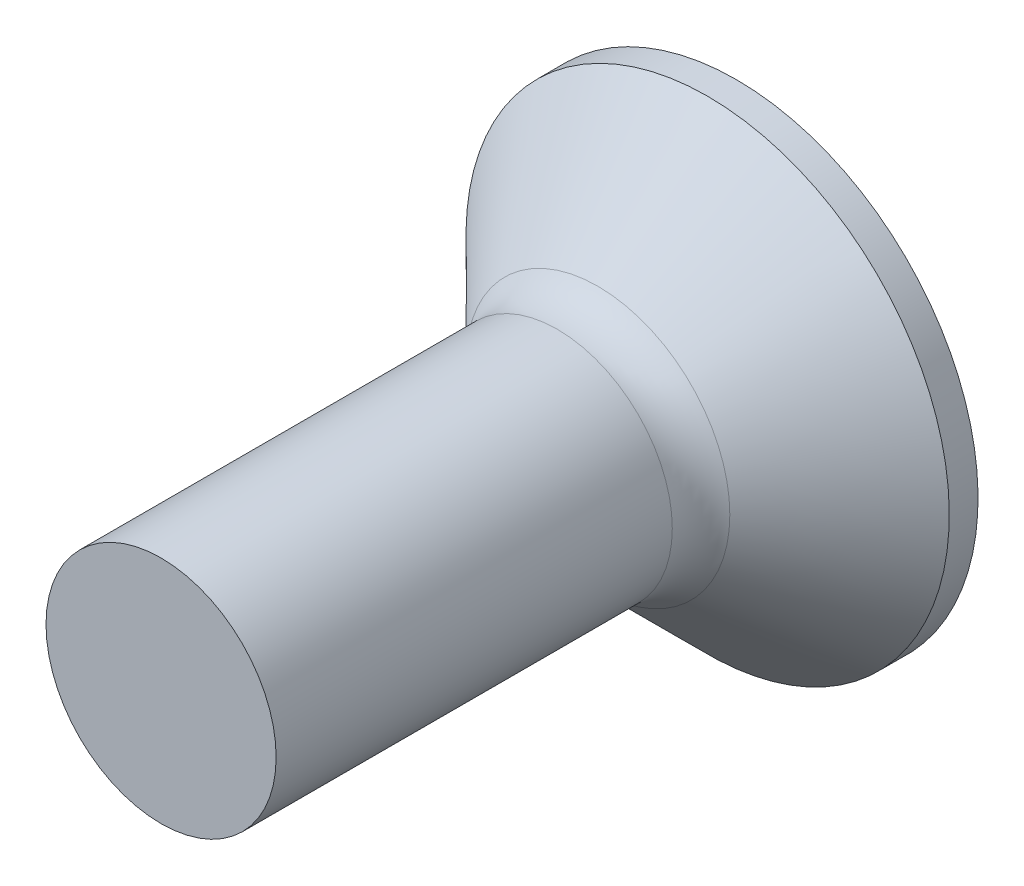
ISO-10303-21;
HEADER;
FILE_DESCRIPTION(('STEP AP214'),'2;1');
FILE_NAME('part.step','',(''),(''),'','','');
FILE_SCHEMA(('AUTOMOTIVE_DESIGN { 1 0 10303 214 1 1 1 1 }'));
ENDSEC;
DATA;
#1=APPLICATION_CONTEXT('core data for automotive mechanical design processes');
#2=APPLICATION_PROTOCOL_DEFINITION('international standard','automotive_design',2000,#1);
#3=PRODUCT_CONTEXT('',#1,'mechanical');
#4=PRODUCT('Part','Part','',(#3));
#5=PRODUCT_RELATED_PRODUCT_CATEGORY('part','',(#4));
#6=PRODUCT_DEFINITION_FORMATION('','',#4);
#7=PRODUCT_DEFINITION_CONTEXT('part definition',#1,'design');
#8=PRODUCT_DEFINITION('design','',#6,#7);
#9=PRODUCT_DEFINITION_SHAPE('','',#8);
#10=(LENGTH_UNIT() NAMED_UNIT(*) SI_UNIT(.MILLI.,.METRE.));
#11=(NAMED_UNIT(*) PLANE_ANGLE_UNIT() SI_UNIT($,.RADIAN.));
#12=(NAMED_UNIT(*) SI_UNIT($,.STERADIAN.) SOLID_ANGLE_UNIT());
#13=UNCERTAINTY_MEASURE_WITH_UNIT(LENGTH_MEASURE(1.E-05),#10,'distance_accuracy_value','');
#14=(GEOMETRIC_REPRESENTATION_CONTEXT(3) GLOBAL_UNCERTAINTY_ASSIGNED_CONTEXT((#13)) GLOBAL_UNIT_ASSIGNED_CONTEXT((#10,
#11,#12)) REPRESENTATION_CONTEXT('',''));
#15=CARTESIAN_POINT('',(0.,0.,0.));
#16=DIRECTION('',(0.,0.,1.));
#17=DIRECTION('',(1.,0.,0.));
#18=AXIS2_PLACEMENT_3D('',#15,#16,#17);
#19=CARTESIAN_POINT('',(0.,0.,-2.7));
#20=DIRECTION('',(0.,0.,-1.));
#21=DIRECTION('',(0.,1.,0.));
#22=AXIS2_PLACEMENT_3D('',#19,#20,#21);
#23=CONICAL_SURFACE('',#22,4.69999999999997,0.785398163397443);
#24=CARTESIAN_POINT('',(0.,0.,-0.292893218813454));
#25=DIRECTION('',(0.,0.,-1.));
#26=DIRECTION('',(0.,1.,0.));
#27=AXIS2_PLACEMENT_3D('',#24,#25,#26);
#28=CIRCLE('',#27,2.29289321881345);
#29=CARTESIAN_POINT('',(0.,2.29289321881345,-0.292893218813453));
#30=VERTEX_POINT('',#29);
#31=EDGE_CURVE('E42',#30,#30,#28,.T.);
#32=ORIENTED_EDGE('',*,*,#31,.T.);
#33=EDGE_LOOP('',(#32));
#34=FACE_BOUND('',#33,.T.);
#35=CARTESIAN_POINT('',(0.,0.,-2.20000000000003));
#36=DIRECTION('',(0.,0.,-1.));
#37=DIRECTION('',(0.,1.,0.));
#38=AXIS2_PLACEMENT_3D('',#35,#36,#37);
#39=CIRCLE('',#38,4.2);
#40=CARTESIAN_POINT('',(0.,4.2,-2.20000000000002));
#41=VERTEX_POINT('',#40);
#42=EDGE_CURVE('E266',#41,#41,#39,.F.);
#43=ORIENTED_EDGE('',*,*,#42,.T.);
#44=EDGE_LOOP('',(#43));
#45=FACE_BOUND('',#44,.T.);
#46=ADVANCED_FACE('F34',(#34,#45),#23,.T.);
#47=CARTESIAN_POINT('',(0.,0.,7.3));
#48=DIRECTION('',(0.,0.,1.));
#49=DIRECTION('',(0.,-1.,0.));
#50=AXIS2_PLACEMENT_3D('',#47,#48,#49);
#51=PLANE('',#50);
#52=CARTESIAN_POINT('',(0.,0.,7.3));
#53=DIRECTION('',(0.,0.,-1.));
#54=DIRECTION('',(0.,1.,0.));
#55=AXIS2_PLACEMENT_3D('',#52,#53,#54);
#56=CIRCLE('',#55,2.);
#57=CARTESIAN_POINT('',(0.,2.,7.3));
#58=VERTEX_POINT('',#57);
#59=EDGE_CURVE('E269',#58,#58,#56,.T.);
#60=ORIENTED_EDGE('',*,*,#59,.F.);
#61=EDGE_LOOP('',(#60));
#62=FACE_BOUND('',#61,.T.);
#63=ADVANCED_FACE('F36',(#62),#51,.T.);
#64=CARTESIAN_POINT('',(0.,0.,-2.7));
#65=DIRECTION('',(0.,0.,-1.));
#66=DIRECTION('',(0.,1.,0.));
#67=AXIS2_PLACEMENT_3D('',#64,#65,#66);
#68=CYLINDRICAL_SURFACE('',#67,2.);
#69=CARTESIAN_POINT('',(0.,0.,0.414213562373091));
#70=DIRECTION('',(0.,0.,-1.));
#71=DIRECTION('',(0.,1.,0.));
#72=AXIS2_PLACEMENT_3D('',#69,#70,#71);
#73=CIRCLE('',#72,2.);
#74=CARTESIAN_POINT('',(0.,2.,0.414213562373091));
#75=VERTEX_POINT('',#74);
#76=EDGE_CURVE('E11',#75,#75,#73,.F.);
#77=ORIENTED_EDGE('',*,*,#76,.T.);
#78=EDGE_LOOP('',(#77));
#79=FACE_BOUND('',#78,.T.);
#80=ORIENTED_EDGE('',*,*,#59,.T.);
#81=EDGE_LOOP('',(#80));
#82=FACE_BOUND('',#81,.T.);
#83=ADVANCED_FACE('F298',(#79,#82),#68,.T.);
#84=CARTESIAN_POINT('',(0.,0.,7.3));
#85=DIRECTION('',(0.,0.,-1.));
#86=DIRECTION('',(0.,1.,0.));
#87=AXIS2_PLACEMENT_3D('',#84,#85,#86);
#88=CYLINDRICAL_SURFACE('',#87,4.2);
#89=ORIENTED_EDGE('',*,*,#42,.F.);
#90=EDGE_LOOP('',(#89));
#91=FACE_BOUND('',#90,.T.);
#92=CARTESIAN_POINT('',(0.,0.,-2.7));
#93=DIRECTION('',(0.,0.,-1.));
#94=DIRECTION('',(0.,1.,0.));
#95=AXIS2_PLACEMENT_3D('',#92,#93,#94);
#96=CIRCLE('',#95,4.2);
#97=CARTESIAN_POINT('',(0.,4.2,-2.7));
#98=VERTEX_POINT('',#97);
#99=EDGE_CURVE('E262',#98,#98,#96,.T.);
#100=ORIENTED_EDGE('',*,*,#99,.F.);
#101=EDGE_LOOP('',(#100));
#102=FACE_BOUND('',#101,.T.);
#103=ADVANCED_FACE('F288',(#91,#102),#88,.T.);
#104=CARTESIAN_POINT('',(0.,4.69999999999997,-2.7));
#105=DIRECTION('',(0.,0.,-1.));
#106=DIRECTION('',(0.,1.,0.));
#107=AXIS2_PLACEMENT_3D('',#104,#105,#106);
#108=PLANE('',#107);
#109=CARTESIAN_POINT('',(1.13749999999999,-1.9702077936096,-2.7));
#110=DIRECTION('',(0.,0.,1.));
#111=DIRECTION('',(0.,1.,0.));
#112=AXIS2_PLACEMENT_3D('',#109,#110,#111);
#113=CIRCLE('',#112,0.85);
#114=CARTESIAN_POINT('',(1.51678967355004,-1.20952432229036,-2.7));
#115=VERTEX_POINT('',#114);
#116=CARTESIAN_POINT('',(0.289083952823566,-1.91834055063742,-2.7));
#117=VERTEX_POINT('',#116);
#118=EDGE_CURVE('E183',#115,#117,#113,.T.);
#119=ORIENTED_EDGE('',*,*,#118,.F.);
#120=CARTESIAN_POINT('',(0.,0.,-2.7));
#121=DIRECTION('',(0.,0.,-1.));
#122=DIRECTION('',(0.,1.,0.));
#123=AXIS2_PLACEMENT_3D('',#120,#121,#122);
#124=CIRCLE('',#123,1.94);
#125=CARTESIAN_POINT('',(1.80587362637363,-0.708816228347071,-2.7));
#126=VERTEX_POINT('',#125);
#127=EDGE_CURVE('E180',#126,#115,#124,.T.);
#128=ORIENTED_EDGE('',*,*,#127,.F.);
#129=CARTESIAN_POINT('',(2.275,0.,-2.7));
#130=DIRECTION('',(0.,0.,1.));
#131=DIRECTION('',(0.,1.,0.));
#132=AXIS2_PLACEMENT_3D('',#129,#130,#131);
#133=CIRCLE('',#132,0.85);
#134=CARTESIAN_POINT('',(1.80587362637363,0.708816228347071,-2.7));
#135=VERTEX_POINT('',#134);
#136=EDGE_CURVE('E178',#135,#126,#133,.T.);
#137=ORIENTED_EDGE('',*,*,#136,.F.);
#138=CARTESIAN_POINT('',(0.,0.,-2.7));
#139=DIRECTION('',(0.,0.,-1.));
#140=DIRECTION('',(0.,1.,0.));
#141=AXIS2_PLACEMENT_3D('',#138,#139,#140);
#142=CIRCLE('',#141,1.94);
#143=CARTESIAN_POINT('',(1.51678967355005,1.20952432229035,-2.7));
#144=VERTEX_POINT('',#143);
#145=EDGE_CURVE('E175',#144,#135,#142,.T.);
#146=ORIENTED_EDGE('',*,*,#145,.F.);
#147=CARTESIAN_POINT('',(1.1375,1.9702077936096,-2.7));
#148=DIRECTION('',(0.,0.,1.));
#149=DIRECTION('',(0.,1.,0.));
#150=AXIS2_PLACEMENT_3D('',#147,#148,#149);
#151=CIRCLE('',#150,0.85);
#152=CARTESIAN_POINT('',(0.289083952823581,1.91834055063742,-2.7));
#153=VERTEX_POINT('',#152);
#154=EDGE_CURVE('E170',#153,#144,#151,.T.);
#155=ORIENTED_EDGE('',*,*,#154,.F.);
#156=CARTESIAN_POINT('',(0.,0.,-2.7));
#157=DIRECTION('',(0.,0.,-1.));
#158=DIRECTION('',(0.,1.,0.));
#159=AXIS2_PLACEMENT_3D('',#156,#157,#158);
#160=CIRCLE('',#159,1.94);
#161=CARTESIAN_POINT('',(-0.289083952823582,1.91834055063742,-2.7));
#162=VERTEX_POINT('',#161);
#163=EDGE_CURVE('E168',#162,#153,#160,.T.);
#164=ORIENTED_EDGE('',*,*,#163,.F.);
#165=CARTESIAN_POINT('',(-1.1375,1.9702077936096,-2.7));
#166=DIRECTION('',(0.,0.,1.));
#167=DIRECTION('',(0.,1.,0.));
#168=AXIS2_PLACEMENT_3D('',#165,#166,#167);
#169=CIRCLE('',#168,0.85);
#170=CARTESIAN_POINT('',(-1.51678967355005,1.20952432229035,-2.7));
#171=VERTEX_POINT('',#170);
#172=EDGE_CURVE('E150',#171,#162,#169,.T.);
#173=ORIENTED_EDGE('',*,*,#172,.F.);
#174=CARTESIAN_POINT('',(0.,0.,-2.7));
#175=DIRECTION('',(0.,0.,-1.));
#176=DIRECTION('',(0.,1.,0.));
#177=AXIS2_PLACEMENT_3D('',#174,#175,#176);
#178=CIRCLE('',#177,1.94);
#179=CARTESIAN_POINT('',(-1.80587362637363,0.708816228347072,-2.7));
#180=VERTEX_POINT('',#179);
#181=EDGE_CURVE('E159',#180,#171,#178,.T.);
#182=ORIENTED_EDGE('',*,*,#181,.F.);
#183=CARTESIAN_POINT('',(-2.275,0.,-2.7));
#184=DIRECTION('',(0.,0.,1.));
#185=DIRECTION('',(0.,1.,0.));
#186=AXIS2_PLACEMENT_3D('',#183,#184,#185);
#187=CIRCLE('',#186,0.85);
#188=CARTESIAN_POINT('',(-1.80587362637363,-0.708816228347072,-2.7));
#189=VERTEX_POINT('',#188);
#190=EDGE_CURVE('E162',#189,#180,#187,.T.);
#191=ORIENTED_EDGE('',*,*,#190,.F.);
#192=CARTESIAN_POINT('',(0.,0.,-2.7));
#193=DIRECTION('',(0.,0.,-1.));
#194=DIRECTION('',(0.,1.,0.));
#195=AXIS2_PLACEMENT_3D('',#192,#193,#194);
#196=CIRCLE('',#195,1.94);
#197=CARTESIAN_POINT('',(-1.51678967355004,-1.20952432229036,-2.7));
#198=VERTEX_POINT('',#197);
#199=EDGE_CURVE('E190',#198,#189,#196,.T.);
#200=ORIENTED_EDGE('',*,*,#199,.F.);
#201=CARTESIAN_POINT('',(-1.13749999999999,-1.9702077936096,-2.7));
#202=DIRECTION('',(0.,0.,1.));
#203=DIRECTION('',(0.,1.,0.));
#204=AXIS2_PLACEMENT_3D('',#201,#202,#203);
#205=CIRCLE('',#204,0.85);
#206=CARTESIAN_POINT('',(-0.289083952823567,-1.91834055063743,-2.7));
#207=VERTEX_POINT('',#206);
#208=EDGE_CURVE('E188',#207,#198,#205,.T.);
#209=ORIENTED_EDGE('',*,*,#208,.F.);
#210=CARTESIAN_POINT('',(0.,0.,-2.7));
#211=DIRECTION('',(0.,0.,-1.));
#212=DIRECTION('',(0.,1.,0.));
#213=AXIS2_PLACEMENT_3D('',#210,#211,#212);
#214=CIRCLE('',#213,1.94);
#215=EDGE_CURVE('E185',#117,#207,#214,.T.);
#216=ORIENTED_EDGE('',*,*,#215,.F.);
#217=EDGE_LOOP('',(#119,#128,#137,#146,#155,#164,#173,#182,#191,#200,#209,#216));
#218=FACE_BOUND('',#217,.T.);
#219=ORIENTED_EDGE('',*,*,#99,.T.);
#220=EDGE_LOOP('',(#219));
#221=FACE_BOUND('',#220,.T.);
#222=ADVANCED_FACE('F165',(#218,#221),#108,.T.);
#223=CARTESIAN_POINT('',(0.,0.,0.414213562373091));
#224=DIRECTION('',(0.,0.,-1.));
#225=DIRECTION('',(0.,1.,0.));
#226=AXIS2_PLACEMENT_3D('',#223,#224,#225);
#227=TOROIDAL_SURFACE('',#226,3.,1.);
#228=ORIENTED_EDGE('',*,*,#76,.F.);
#229=EDGE_LOOP('',(#228));
#230=FACE_BOUND('',#229,.T.);
#231=ORIENTED_EDGE('',*,*,#31,.F.);
#232=EDGE_LOOP('',(#231));
#233=FACE_BOUND('',#232,.T.);
#234=ADVANCED_FACE('F276',(#230,#233),#227,.F.);
#235=CARTESIAN_POINT('',(-2.275,0.,-1.6));
#236=DIRECTION('',(0.,0.,-1.));
#237=DIRECTION('',(0.,1.,0.));
#238=AXIS2_PLACEMENT_3D('',#235,#236,#237);
#239=CYLINDRICAL_SURFACE('',#238,0.85);
#240=CARTESIAN_POINT('',(-2.275,0.,-1.6));
#241=DIRECTION('',(0.,0.,1.));
#242=DIRECTION('',(0.,1.,0.));
#243=AXIS2_PLACEMENT_3D('',#240,#241,#242);
#244=CIRCLE('',#243,0.85);
#245=CARTESIAN_POINT('',(-1.80587362637363,-0.708816228347072,-1.6));
#246=VERTEX_POINT('',#245);
#247=CARTESIAN_POINT('',(-1.425,0.,-1.6));
#248=VERTEX_POINT('',#247);
#249=EDGE_CURVE('E194',#246,#248,#244,.T.);
#250=ORIENTED_EDGE('',*,*,#249,.F.);
#251=DIRECTION('',(0.,0.,-1.));
#252=VECTOR('',#251,1.);
#253=CARTESIAN_POINT('',(-1.80587362637363,-0.708816228347072,-1.6));
#254=LINE('',#253,#252);
#255=EDGE_CURVE('E229',#246,#189,#254,.T.);
#256=ORIENTED_EDGE('',*,*,#255,.T.);
#257=ORIENTED_EDGE('',*,*,#190,.T.);
#258=DIRECTION('',(0.,0.,-1.));
#259=VECTOR('',#258,1.);
#260=CARTESIAN_POINT('',(-1.80587362637363,0.708816228347072,-1.6));
#261=LINE('',#260,#259);
#262=CARTESIAN_POINT('',(-1.80587362637363,0.708816228347072,-1.6));
#263=VERTEX_POINT('',#262);
#264=EDGE_CURVE('E49',#263,#180,#261,.T.);
#265=ORIENTED_EDGE('',*,*,#264,.F.);
#266=EDGE_CURVE('E193',#248,#263,#244,.T.);
#267=ORIENTED_EDGE('',*,*,#266,.F.);
#268=EDGE_LOOP('',(#250,#256,#257,#265,#267));
#269=FACE_BOUND('',#268,.T.);
#270=ADVANCED_FACE('F278',(#269),#239,.T.);
#271=CARTESIAN_POINT('',(-1.13749999999999,-1.9702077936096,-1.6));
#272=DIRECTION('',(0.,0.,-1.));
#273=DIRECTION('',(0.,1.,0.));
#274=AXIS2_PLACEMENT_3D('',#271,#272,#273);
#275=CYLINDRICAL_SURFACE('',#274,0.85);
#276=CARTESIAN_POINT('',(-1.13749999999999,-1.9702077936096,-1.6));
#277=DIRECTION('',(0.,0.,1.));
#278=DIRECTION('',(0.,1.,0.));
#279=AXIS2_PLACEMENT_3D('',#276,#277,#278);
#280=CIRCLE('',#279,0.85);
#281=CARTESIAN_POINT('',(-0.289083952823567,-1.91834055063743,-1.6));
#282=VERTEX_POINT('',#281);
#283=CARTESIAN_POINT('',(-0.712499999999993,-1.23408620039283,-1.6));
#284=VERTEX_POINT('',#283);
#285=EDGE_CURVE('E223',#282,#284,#280,.T.);
#286=ORIENTED_EDGE('',*,*,#285,.F.);
#287=DIRECTION('',(0.,0.,-1.));
#288=VECTOR('',#287,1.);
#289=CARTESIAN_POINT('',(-0.289083952823567,-1.91834055063743,-1.6));
#290=LINE('',#289,#288);
#291=EDGE_CURVE('E236',#282,#207,#290,.T.);
#292=ORIENTED_EDGE('',*,*,#291,.T.);
#293=ORIENTED_EDGE('',*,*,#208,.T.);
#294=DIRECTION('',(0.,0.,-1.));
#295=VECTOR('',#294,1.);
#296=CARTESIAN_POINT('',(-1.51678967355004,-1.20952432229036,-1.6));
#297=LINE('',#296,#295);
#298=CARTESIAN_POINT('',(-1.51678967355004,-1.20952432229036,-1.6));
#299=VERTEX_POINT('',#298);
#300=EDGE_CURVE('E233',#299,#198,#297,.T.);
#301=ORIENTED_EDGE('',*,*,#300,.F.);
#302=EDGE_CURVE('E222',#284,#299,#280,.T.);
#303=ORIENTED_EDGE('',*,*,#302,.F.);
#304=EDGE_LOOP('',(#286,#292,#293,#301,#303));
#305=FACE_BOUND('',#304,.T.);
#306=ADVANCED_FACE('F285',(#305),#275,.T.);
#307=CARTESIAN_POINT('',(1.13749999999999,-1.9702077936096,-1.6));
#308=DIRECTION('',(0.,0.,-1.));
#309=DIRECTION('',(0.,1.,0.));
#310=AXIS2_PLACEMENT_3D('',#307,#308,#309);
#311=CYLINDRICAL_SURFACE('',#310,0.85);
#312=CARTESIAN_POINT('',(1.13749999999999,-1.9702077936096,-1.6));
#313=DIRECTION('',(0.,0.,1.));
#314=DIRECTION('',(0.,1.,0.));
#315=AXIS2_PLACEMENT_3D('',#312,#313,#314);
#316=CIRCLE('',#315,0.85);
#317=CARTESIAN_POINT('',(1.51678967355004,-1.20952432229036,-1.6));
#318=VERTEX_POINT('',#317);
#319=CARTESIAN_POINT('',(0.712499999999993,-1.23408620039283,-1.6));
#320=VERTEX_POINT('',#319);
#321=EDGE_CURVE('E216',#318,#320,#316,.T.);
#322=ORIENTED_EDGE('',*,*,#321,.F.);
#323=DIRECTION('',(0.,0.,-1.));
#324=VECTOR('',#323,1.);
#325=CARTESIAN_POINT('',(1.51678967355004,-1.20952432229036,-1.6));
#326=LINE('',#325,#324);
#327=EDGE_CURVE('E242',#318,#115,#326,.T.);
#328=ORIENTED_EDGE('',*,*,#327,.T.);
#329=ORIENTED_EDGE('',*,*,#118,.T.);
#330=DIRECTION('',(0.,0.,-1.));
#331=VECTOR('',#330,1.);
#332=CARTESIAN_POINT('',(0.289083952823566,-1.91834055063743,-1.6));
#333=LINE('',#332,#331);
#334=CARTESIAN_POINT('',(0.289083952823566,-1.91834055063743,-1.6));
#335=VERTEX_POINT('',#334);
#336=EDGE_CURVE('E239',#335,#117,#333,.T.);
#337=ORIENTED_EDGE('',*,*,#336,.F.);
#338=EDGE_CURVE('E215',#320,#335,#316,.T.);
#339=ORIENTED_EDGE('',*,*,#338,.F.);
#340=EDGE_LOOP('',(#322,#328,#329,#337,#339));
#341=FACE_BOUND('',#340,.T.);
#342=ADVANCED_FACE('F340',(#341),#311,.T.);
#343=CARTESIAN_POINT('',(2.275,0.,-1.6));
#344=DIRECTION('',(0.,0.,-1.));
#345=DIRECTION('',(0.,1.,0.));
#346=AXIS2_PLACEMENT_3D('',#343,#344,#345);
#347=CYLINDRICAL_SURFACE('',#346,0.85);
#348=CARTESIAN_POINT('',(2.275,0.,-1.6));
#349=DIRECTION('',(0.,0.,1.));
#350=DIRECTION('',(0.,1.,0.));
#351=AXIS2_PLACEMENT_3D('',#348,#349,#350);
#352=CIRCLE('',#351,0.85);
#353=CARTESIAN_POINT('',(1.80587362637363,0.708816228347071,-1.6));
#354=VERTEX_POINT('',#353);
#355=CARTESIAN_POINT('',(1.425,0.,-1.6));
#356=VERTEX_POINT('',#355);
#357=EDGE_CURVE('E209',#354,#356,#352,.T.);
#358=ORIENTED_EDGE('',*,*,#357,.F.);
#359=DIRECTION('',(0.,0.,-1.));
#360=VECTOR('',#359,1.);
#361=CARTESIAN_POINT('',(1.80587362637363,0.708816228347071,-1.6));
#362=LINE('',#361,#360);
#363=EDGE_CURVE('E248',#354,#135,#362,.T.);
#364=ORIENTED_EDGE('',*,*,#363,.T.);
#365=ORIENTED_EDGE('',*,*,#136,.T.);
#366=DIRECTION('',(0.,0.,-1.));
#367=VECTOR('',#366,1.);
#368=CARTESIAN_POINT('',(1.80587362637363,-0.708816228347071,-1.6));
#369=LINE('',#368,#367);
#370=CARTESIAN_POINT('',(1.80587362637363,-0.708816228347071,-1.6));
#371=VERTEX_POINT('',#370);
#372=EDGE_CURVE('E245',#371,#126,#369,.T.);
#373=ORIENTED_EDGE('',*,*,#372,.F.);
#374=EDGE_CURVE('E208',#356,#371,#352,.T.);
#375=ORIENTED_EDGE('',*,*,#374,.F.);
#376=EDGE_LOOP('',(#358,#364,#365,#373,#375));
#377=FACE_BOUND('',#376,.T.);
#378=ADVANCED_FACE('F350',(#377),#347,.T.);
#379=CARTESIAN_POINT('',(1.1375,1.9702077936096,-1.6));
#380=DIRECTION('',(0.,0.,-1.));
#381=DIRECTION('',(0.,1.,0.));
#382=AXIS2_PLACEMENT_3D('',#379,#380,#381);
#383=CYLINDRICAL_SURFACE('',#382,0.85);
#384=CARTESIAN_POINT('',(1.1375,1.9702077936096,-1.6));
#385=DIRECTION('',(0.,0.,1.));
#386=DIRECTION('',(0.,1.,0.));
#387=AXIS2_PLACEMENT_3D('',#384,#385,#386);
#388=CIRCLE('',#387,0.85);
#389=CARTESIAN_POINT('',(0.289083952823581,1.91834055063742,-1.6));
#390=VERTEX_POINT('',#389);
#391=CARTESIAN_POINT('',(0.712500000000002,1.23408620039282,-1.6));
#392=VERTEX_POINT('',#391);
#393=EDGE_CURVE('E57',#390,#392,#388,.T.);
#394=ORIENTED_EDGE('',*,*,#393,.F.);
#395=DIRECTION('',(0.,0.,-1.));
#396=VECTOR('',#395,1.);
#397=CARTESIAN_POINT('',(0.289083952823581,1.91834055063742,-1.6));
#398=LINE('',#397,#396);
#399=EDGE_CURVE('E254',#390,#153,#398,.T.);
#400=ORIENTED_EDGE('',*,*,#399,.T.);
#401=ORIENTED_EDGE('',*,*,#154,.T.);
#402=DIRECTION('',(0.,0.,-1.));
#403=VECTOR('',#402,1.);
#404=CARTESIAN_POINT('',(1.51678967355005,1.20952432229035,-1.6));
#405=LINE('',#404,#403);
#406=CARTESIAN_POINT('',(1.51678967355005,1.20952432229035,-1.6));
#407=VERTEX_POINT('',#406);
#408=EDGE_CURVE('E251',#407,#144,#405,.T.);
#409=ORIENTED_EDGE('',*,*,#408,.F.);
#410=EDGE_CURVE('E203',#392,#407,#388,.T.);
#411=ORIENTED_EDGE('',*,*,#410,.F.);
#412=EDGE_LOOP('',(#394,#400,#401,#409,#411));
#413=FACE_BOUND('',#412,.T.);
#414=ADVANCED_FACE('F360',(#413),#383,.T.);
#415=CARTESIAN_POINT('',(-1.1375,1.9702077936096,-1.6));
#416=DIRECTION('',(0.,0.,-1.));
#417=DIRECTION('',(0.,1.,0.));
#418=AXIS2_PLACEMENT_3D('',#415,#416,#417);
#419=CYLINDRICAL_SURFACE('',#418,0.85);
#420=CARTESIAN_POINT('',(-1.1375,1.9702077936096,-1.6));
#421=DIRECTION('',(0.,0.,1.));
#422=DIRECTION('',(0.,1.,0.));
#423=AXIS2_PLACEMENT_3D('',#420,#421,#422);
#424=CIRCLE('',#423,0.85);
#425=CARTESIAN_POINT('',(-1.51678967355005,1.20952432229035,-1.6));
#426=VERTEX_POINT('',#425);
#427=CARTESIAN_POINT('',(-0.712500000000002,1.23408620039283,-1.6));
#428=VERTEX_POINT('',#427);
#429=EDGE_CURVE('E154',#426,#428,#424,.T.);
#430=ORIENTED_EDGE('',*,*,#429,.F.);
#431=DIRECTION('',(0.,0.,-1.));
#432=VECTOR('',#431,1.);
#433=CARTESIAN_POINT('',(-1.51678967355005,1.20952432229035,-1.6));
#434=LINE('',#433,#432);
#435=EDGE_CURVE('E146',#426,#171,#434,.T.);
#436=ORIENTED_EDGE('',*,*,#435,.T.);
#437=ORIENTED_EDGE('',*,*,#172,.T.);
#438=DIRECTION('',(0.,0.,-1.));
#439=VECTOR('',#438,1.);
#440=CARTESIAN_POINT('',(-0.289083952823582,1.91834055063742,-1.6));
#441=LINE('',#440,#439);
#442=CARTESIAN_POINT('',(-0.289083952823582,1.91834055063742,-1.6));
#443=VERTEX_POINT('',#442);
#444=EDGE_CURVE('E156',#443,#162,#441,.T.);
#445=ORIENTED_EDGE('',*,*,#444,.F.);
#446=EDGE_CURVE('E199',#428,#443,#424,.T.);
#447=ORIENTED_EDGE('',*,*,#446,.F.);
#448=EDGE_LOOP('',(#430,#436,#437,#445,#447));
#449=FACE_BOUND('',#448,.T.);
#450=ADVANCED_FACE('F147',(#449),#419,.T.);
#451=CARTESIAN_POINT('',(-1.1375,0.,-1.6));
#452=DIRECTION('',(0.,0.,-1.));
#453=DIRECTION('',(0.,1.,0.));
#454=AXIS2_PLACEMENT_3D('',#451,#452,#453);
#455=PLANE('',#454);
#456=CARTESIAN_POINT('',(0.,0.,-1.6));
#457=DIRECTION('',(0.,0.,-1.));
#458=DIRECTION('',(0.,1.,0.));
#459=AXIS2_PLACEMENT_3D('',#456,#457,#458);
#460=CIRCLE('',#459,1.425);
#461=EDGE_CURVE('E518',#248,#428,#460,.T.);
#462=ORIENTED_EDGE('',*,*,#461,.F.);
#463=ORIENTED_EDGE('',*,*,#266,.T.);
#464=CARTESIAN_POINT('',(0.,0.,-1.6));
#465=DIRECTION('',(0.,0.,-1.));
#466=DIRECTION('',(0.,1.,0.));
#467=AXIS2_PLACEMENT_3D('',#464,#465,#466);
#468=CIRCLE('',#467,1.94);
#469=EDGE_CURVE('E197',#263,#426,#468,.T.);
#470=ORIENTED_EDGE('',*,*,#469,.T.);
#471=ORIENTED_EDGE('',*,*,#429,.T.);
#472=EDGE_LOOP('',(#462,#463,#470,#471));
#473=FACE_BOUND('',#472,.T.);
#474=ADVANCED_FACE('F379',(#473),#455,.T.);
#475=EDGE_CURVE('E516',#284,#248,#460,.T.);
#476=ORIENTED_EDGE('',*,*,#475,.F.);
#477=ORIENTED_EDGE('',*,*,#302,.T.);
#478=CARTESIAN_POINT('',(0.,0.,-1.6));
#479=DIRECTION('',(0.,0.,-1.));
#480=DIRECTION('',(0.,1.,0.));
#481=AXIS2_PLACEMENT_3D('',#478,#479,#480);
#482=CIRCLE('',#481,1.94);
#483=EDGE_CURVE('E226',#299,#246,#482,.T.);
#484=ORIENTED_EDGE('',*,*,#483,.T.);
#485=ORIENTED_EDGE('',*,*,#249,.T.);
#486=EDGE_LOOP('',(#476,#477,#484,#485));
#487=FACE_BOUND('',#486,.T.);
#488=ADVANCED_FACE('F388',(#487),#455,.T.);
#489=EDGE_CURVE('E515',#320,#284,#460,.T.);
#490=ORIENTED_EDGE('',*,*,#489,.F.);
#491=ORIENTED_EDGE('',*,*,#338,.T.);
#492=CARTESIAN_POINT('',(0.,0.,-1.6));
#493=DIRECTION('',(0.,0.,-1.));
#494=DIRECTION('',(0.,1.,0.));
#495=AXIS2_PLACEMENT_3D('',#492,#493,#494);
#496=CIRCLE('',#495,1.94);
#497=EDGE_CURVE('E219',#335,#282,#496,.T.);
#498=ORIENTED_EDGE('',*,*,#497,.T.);
#499=ORIENTED_EDGE('',*,*,#285,.T.);
#500=EDGE_LOOP('',(#490,#491,#498,#499));
#501=FACE_BOUND('',#500,.T.);
#502=ADVANCED_FACE('F399',(#501),#455,.T.);
#503=EDGE_CURVE('E263',#356,#320,#460,.T.);
#504=ORIENTED_EDGE('',*,*,#503,.F.);
#505=ORIENTED_EDGE('',*,*,#374,.T.);
#506=CARTESIAN_POINT('',(0.,0.,-1.6));
#507=DIRECTION('',(0.,0.,-1.));
#508=DIRECTION('',(0.,1.,0.));
#509=AXIS2_PLACEMENT_3D('',#506,#507,#508);
#510=CIRCLE('',#509,1.94);
#511=EDGE_CURVE('E212',#371,#318,#510,.T.);
#512=ORIENTED_EDGE('',*,*,#511,.T.);
#513=ORIENTED_EDGE('',*,*,#321,.T.);
#514=EDGE_LOOP('',(#504,#505,#512,#513));
#515=FACE_BOUND('',#514,.T.);
#516=ADVANCED_FACE('F408',(#515),#455,.T.);
#517=EDGE_CURVE('E259',#392,#356,#460,.T.);
#518=ORIENTED_EDGE('',*,*,#517,.F.);
#519=ORIENTED_EDGE('',*,*,#410,.T.);
#520=CARTESIAN_POINT('',(0.,0.,-1.6));
#521=DIRECTION('',(0.,0.,-1.));
#522=DIRECTION('',(0.,1.,0.));
#523=AXIS2_PLACEMENT_3D('',#520,#521,#522);
#524=CIRCLE('',#523,1.94);
#525=EDGE_CURVE('E205',#407,#354,#524,.T.);
#526=ORIENTED_EDGE('',*,*,#525,.T.);
#527=ORIENTED_EDGE('',*,*,#357,.T.);
#528=EDGE_LOOP('',(#518,#519,#526,#527));
#529=FACE_BOUND('',#528,.T.);
#530=ADVANCED_FACE('F417',(#529),#455,.T.);
#531=EDGE_CURVE('E232',#428,#392,#460,.T.);
#532=ORIENTED_EDGE('',*,*,#531,.F.);
#533=ORIENTED_EDGE('',*,*,#446,.T.);
#534=CARTESIAN_POINT('',(0.,0.,-1.6));
#535=DIRECTION('',(0.,0.,-1.));
#536=DIRECTION('',(0.,1.,0.));
#537=AXIS2_PLACEMENT_3D('',#534,#535,#536);
#538=CIRCLE('',#537,1.94);
#539=EDGE_CURVE('E201',#443,#390,#538,.T.);
#540=ORIENTED_EDGE('',*,*,#539,.T.);
#541=ORIENTED_EDGE('',*,*,#393,.T.);
#542=EDGE_LOOP('',(#532,#533,#540,#541));
#543=FACE_BOUND('',#542,.T.);
#544=ADVANCED_FACE('F391',(#543),#455,.T.);
#545=CARTESIAN_POINT('',(0.,0.,-1.6));
#546=DIRECTION('',(0.,0.,-1.));
#547=DIRECTION('',(0.,1.,0.));
#548=AXIS2_PLACEMENT_3D('',#545,#546,#547);
#549=CYLINDRICAL_SURFACE('',#548,1.94);
#550=ORIENTED_EDGE('',*,*,#199,.T.);
#551=ORIENTED_EDGE('',*,*,#255,.F.);
#552=ORIENTED_EDGE('',*,*,#483,.F.);
#553=ORIENTED_EDGE('',*,*,#300,.T.);
#554=EDGE_LOOP('',(#550,#551,#552,#553));
#555=FACE_BOUND('',#554,.T.);
#556=ADVANCED_FACE('F434',(#555),#549,.F.);
#557=CARTESIAN_POINT('',(0.,0.,-1.6));
#558=DIRECTION('',(0.,0.,-1.));
#559=DIRECTION('',(0.,1.,0.));
#560=AXIS2_PLACEMENT_3D('',#557,#558,#559);
#561=CYLINDRICAL_SURFACE('',#560,1.94);
#562=ORIENTED_EDGE('',*,*,#215,.T.);
#563=ORIENTED_EDGE('',*,*,#291,.F.);
#564=ORIENTED_EDGE('',*,*,#497,.F.);
#565=ORIENTED_EDGE('',*,*,#336,.T.);
#566=EDGE_LOOP('',(#562,#563,#564,#565));
#567=FACE_BOUND('',#566,.T.);
#568=ADVANCED_FACE('F442',(#567),#561,.F.);
#569=CARTESIAN_POINT('',(0.,0.,-1.6));
#570=DIRECTION('',(0.,0.,-1.));
#571=DIRECTION('',(0.,1.,0.));
#572=AXIS2_PLACEMENT_3D('',#569,#570,#571);
#573=CYLINDRICAL_SURFACE('',#572,1.94);
#574=ORIENTED_EDGE('',*,*,#127,.T.);
#575=ORIENTED_EDGE('',*,*,#327,.F.);
#576=ORIENTED_EDGE('',*,*,#511,.F.);
#577=ORIENTED_EDGE('',*,*,#372,.T.);
#578=EDGE_LOOP('',(#574,#575,#576,#577));
#579=FACE_BOUND('',#578,.T.);
#580=ADVANCED_FACE('F452',(#579),#573,.F.);
#581=CARTESIAN_POINT('',(0.,0.,-1.6));
#582=DIRECTION('',(0.,0.,-1.));
#583=DIRECTION('',(0.,1.,0.));
#584=AXIS2_PLACEMENT_3D('',#581,#582,#583);
#585=CYLINDRICAL_SURFACE('',#584,1.94);
#586=ORIENTED_EDGE('',*,*,#145,.T.);
#587=ORIENTED_EDGE('',*,*,#363,.F.);
#588=ORIENTED_EDGE('',*,*,#525,.F.);
#589=ORIENTED_EDGE('',*,*,#408,.T.);
#590=EDGE_LOOP('',(#586,#587,#588,#589));
#591=FACE_BOUND('',#590,.T.);
#592=ADVANCED_FACE('F462',(#591),#585,.F.);
#593=CARTESIAN_POINT('',(0.,0.,-1.6));
#594=DIRECTION('',(0.,0.,-1.));
#595=DIRECTION('',(0.,1.,0.));
#596=AXIS2_PLACEMENT_3D('',#593,#594,#595);
#597=CYLINDRICAL_SURFACE('',#596,1.94);
#598=ORIENTED_EDGE('',*,*,#163,.T.);
#599=ORIENTED_EDGE('',*,*,#399,.F.);
#600=ORIENTED_EDGE('',*,*,#539,.F.);
#601=ORIENTED_EDGE('',*,*,#444,.T.);
#602=EDGE_LOOP('',(#598,#599,#600,#601));
#603=FACE_BOUND('',#602,.T.);
#604=ADVANCED_FACE('F472',(#603),#597,.F.);
#605=CARTESIAN_POINT('',(0.,0.,-1.6));
#606=DIRECTION('',(0.,0.,-1.));
#607=DIRECTION('',(0.,1.,0.));
#608=AXIS2_PLACEMENT_3D('',#605,#606,#607);
#609=CYLINDRICAL_SURFACE('',#608,1.94);
#610=ORIENTED_EDGE('',*,*,#181,.T.);
#611=ORIENTED_EDGE('',*,*,#435,.F.);
#612=ORIENTED_EDGE('',*,*,#469,.F.);
#613=ORIENTED_EDGE('',*,*,#264,.T.);
#614=EDGE_LOOP('',(#610,#611,#612,#613));
#615=FACE_BOUND('',#614,.T.);
#616=ADVANCED_FACE('F160',(#615),#609,.F.);
#617=CARTESIAN_POINT('',(0.,0.,-1.6));
#618=DIRECTION('',(0.,0.,-1.));
#619=DIRECTION('',(0.,1.,0.));
#620=AXIS2_PLACEMENT_3D('',#617,#618,#619);
#621=CONICAL_SURFACE('',#620,1.425,1.22173047639603);
#622=CARTESIAN_POINT('',(0.,0.,-1.08134241617067));
#623=VERTEX_POINT('',#622);
#624=VERTEX_LOOP('',#623);
#625=FACE_BOUND('',#624,.T.);
#626=ORIENTED_EDGE('',*,*,#517,.T.);
#627=ORIENTED_EDGE('',*,*,#503,.T.);
#628=ORIENTED_EDGE('',*,*,#489,.T.);
#629=ORIENTED_EDGE('',*,*,#475,.T.);
#630=ORIENTED_EDGE('',*,*,#461,.T.);
#631=ORIENTED_EDGE('',*,*,#531,.T.);
#632=EDGE_LOOP('',(#626,#627,#628,#629,#630,#631));
#633=FACE_BOUND('',#632,.T.);
#634=ADVANCED_FACE('F491',(#625,#633),#621,.F.);
#635=CLOSED_SHELL('',(#46,#63,#83,#103,#222,#234,#270,#306,#342,#378,#414,#450,#474,#488,#502,
#516,#530,#544,#556,#568,#580,#592,#604,#616,#634));
#636=MANIFOLD_SOLID_BREP('B2',#635);
#637=ADVANCED_BREP_SHAPE_REPRESENTATION('',(#18,#636),#14);
#638=SHAPE_DEFINITION_REPRESENTATION(#9,#637);
ENDSEC;
END-ISO-10303-21;
